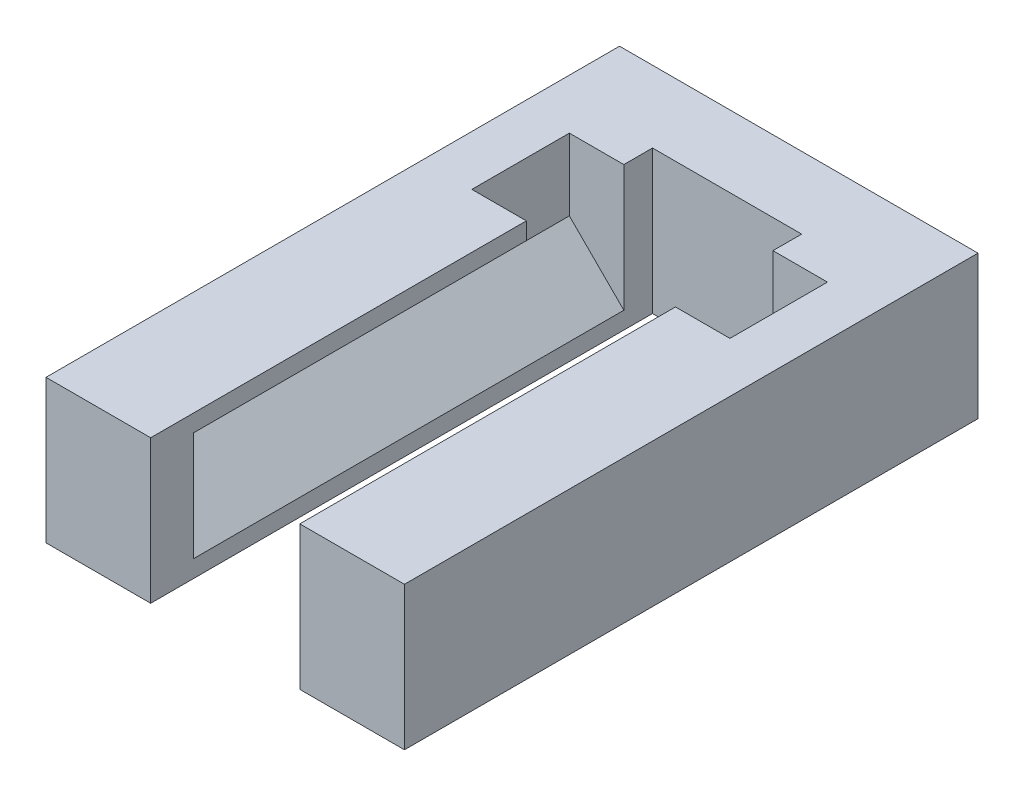
ISO-10303-21;
HEADER;
FILE_DESCRIPTION(('STEP AP214'),'2;1');
FILE_NAME('part.step','',(''),(''),'','','');
FILE_SCHEMA(('AUTOMOTIVE_DESIGN { 1 0 10303 214 1 1 1 1 }'));
ENDSEC;
DATA;
#1=APPLICATION_CONTEXT('core data for automotive mechanical design processes');
#2=APPLICATION_PROTOCOL_DEFINITION('international standard','automotive_design',2000,#1);
#3=PRODUCT_CONTEXT('',#1,'mechanical');
#4=PRODUCT('Part','Part','',(#3));
#5=PRODUCT_RELATED_PRODUCT_CATEGORY('part','',(#4));
#6=PRODUCT_DEFINITION_FORMATION('','',#4);
#7=PRODUCT_DEFINITION_CONTEXT('part definition',#1,'design');
#8=PRODUCT_DEFINITION('design','',#6,#7);
#9=PRODUCT_DEFINITION_SHAPE('','',#8);
#10=(LENGTH_UNIT() NAMED_UNIT(*) SI_UNIT(.MILLI.,.METRE.));
#11=(NAMED_UNIT(*) PLANE_ANGLE_UNIT() SI_UNIT($,.RADIAN.));
#12=(NAMED_UNIT(*) SI_UNIT($,.STERADIAN.) SOLID_ANGLE_UNIT());
#13=UNCERTAINTY_MEASURE_WITH_UNIT(LENGTH_MEASURE(1.E-05),#10,'distance_accuracy_value','');
#14=(GEOMETRIC_REPRESENTATION_CONTEXT(3) GLOBAL_UNCERTAINTY_ASSIGNED_CONTEXT((#13)) GLOBAL_UNIT_ASSIGNED_CONTEXT((#10,
#11,#12)) REPRESENTATION_CONTEXT('',''));
#15=CARTESIAN_POINT('',(0.,0.,0.));
#16=DIRECTION('',(0.,0.,1.));
#17=DIRECTION('',(1.,0.,0.));
#18=AXIS2_PLACEMENT_3D('',#15,#16,#17);
#19=CARTESIAN_POINT('',(-5.2,-5.,5.));
#20=DIRECTION('',(-1.,0.,0.));
#21=DIRECTION('',(0.,0.,1.));
#22=AXIS2_PLACEMENT_3D('',#19,#20,#21);
#23=PLANE('',#22);
#24=DIRECTION('',(0.,0.,-1.));
#25=VECTOR('',#24,1.);
#26=CARTESIAN_POINT('',(-5.2,3.79999999999999,37.));
#27=LINE('',#26,#25);
#28=CARTESIAN_POINT('',(-5.2,3.79999999999999,37.));
#29=VERTEX_POINT('',#28);
#30=CARTESIAN_POINT('',(-5.2,3.79999999999999,13.8));
#31=VERTEX_POINT('',#30);
#32=EDGE_CURVE('E226',#29,#31,#27,.T.);
#33=ORIENTED_EDGE('',*,*,#32,.T.);
#34=DIRECTION('',(0.,1.,0.));
#35=VECTOR('',#34,1.);
#36=CARTESIAN_POINT('',(-5.2,-5.,13.8));
#37=LINE('',#36,#35);
#38=CARTESIAN_POINT('',(-5.2,5.,13.8));
#39=VERTEX_POINT('',#38);
#40=EDGE_CURVE('E283',#31,#39,#37,.T.);
#41=ORIENTED_EDGE('',*,*,#40,.T.);
#42=DIRECTION('',(0.,0.,1.));
#43=VECTOR('',#42,1.);
#44=CARTESIAN_POINT('',(-5.2,5.,5.));
#45=LINE('',#44,#43);
#46=CARTESIAN_POINT('',(-5.2,5.,40.));
#47=VERTEX_POINT('',#46);
#48=EDGE_CURVE('E298',#39,#47,#45,.T.);
#49=ORIENTED_EDGE('',*,*,#48,.T.);
#50=DIRECTION('',(0.,1.,0.));
#51=VECTOR('',#50,1.);
#52=CARTESIAN_POINT('',(-5.2,-5.,40.));
#53=LINE('',#52,#51);
#54=CARTESIAN_POINT('',(-5.2,-5.,40.));
#55=VERTEX_POINT('',#54);
#56=EDGE_CURVE('E309',#55,#47,#53,.T.);
#57=ORIENTED_EDGE('',*,*,#56,.F.);
#58=DIRECTION('',(0.,0.,1.));
#59=VECTOR('',#58,1.);
#60=CARTESIAN_POINT('',(-5.2,-5.,5.));
#61=LINE('',#60,#59);
#62=CARTESIAN_POINT('',(-5.2,-5.,5.));
#63=VERTEX_POINT('',#62);
#64=EDGE_CURVE('E299',#63,#55,#61,.T.);
#65=ORIENTED_EDGE('',*,*,#64,.F.);
#66=DIRECTION('',(0.,1.,0.));
#67=VECTOR('',#66,1.);
#68=CARTESIAN_POINT('',(-5.2,-5.,5.));
#69=LINE('',#68,#67);
#70=CARTESIAN_POINT('',(-5.2,5.,5.));
#71=VERTEX_POINT('',#70);
#72=EDGE_CURVE('E322',#63,#71,#69,.T.);
#73=ORIENTED_EDGE('',*,*,#72,.T.);
#74=CARTESIAN_POINT('',(-5.2,5.,7.));
#75=VERTEX_POINT('',#74);
#76=EDGE_CURVE('E310',#71,#75,#45,.T.);
#77=ORIENTED_EDGE('',*,*,#76,.T.);
#78=DIRECTION('',(0.,-1.,0.));
#79=VECTOR('',#78,1.);
#80=CARTESIAN_POINT('',(-5.2,-5.,7.));
#81=LINE('',#80,#79);
#82=CARTESIAN_POINT('',(-5.2,-3.79999999999999,7.));
#83=VERTEX_POINT('',#82);
#84=EDGE_CURVE('E295',#75,#83,#81,.T.);
#85=ORIENTED_EDGE('',*,*,#84,.T.);
#86=DIRECTION('',(0.,0.,-1.));
#87=VECTOR('',#86,1.);
#88=CARTESIAN_POINT('',(-5.2,-3.79999999999999,37.));
#89=LINE('',#88,#87);
#90=CARTESIAN_POINT('',(-5.2,-3.79999999999999,37.));
#91=VERTEX_POINT('',#90);
#92=EDGE_CURVE('E222',#91,#83,#89,.T.);
#93=ORIENTED_EDGE('',*,*,#92,.F.);
#94=DIRECTION('',(0.,1.,0.));
#95=VECTOR('',#94,1.);
#96=CARTESIAN_POINT('',(-5.2,-3.79999999999999,37.));
#97=LINE('',#96,#95);
#98=EDGE_CURVE('E241',#91,#29,#97,.T.);
#99=ORIENTED_EDGE('',*,*,#98,.T.);
#100=EDGE_LOOP('',(#33,#41,#49,#57,#65,#73,#77,#85,#93,#99));
#101=FACE_BOUND('',#100,.T.);
#102=ADVANCED_FACE('F43',(#101),#23,.F.);
#103=CARTESIAN_POINT('',(5.2,-5.,5.));
#104=DIRECTION('',(1.,0.,0.));
#105=DIRECTION('',(0.,0.,-1.));
#106=AXIS2_PLACEMENT_3D('',#103,#104,#105);
#107=PLANE('',#106);
#108=DIRECTION('',(0.,0.,-1.));
#109=VECTOR('',#108,1.);
#110=CARTESIAN_POINT('',(5.2,3.79999999999999,37.));
#111=LINE('',#110,#109);
#112=CARTESIAN_POINT('',(5.2,3.79999999999999,37.));
#113=VERTEX_POINT('',#112);
#114=CARTESIAN_POINT('',(5.2,3.79999999999999,13.8));
#115=VERTEX_POINT('',#114);
#116=EDGE_CURVE('E209',#113,#115,#111,.T.);
#117=ORIENTED_EDGE('',*,*,#116,.F.);
#118=DIRECTION('',(0.,-1.,0.));
#119=VECTOR('',#118,1.);
#120=CARTESIAN_POINT('',(5.2,-3.79999999999999,37.));
#121=LINE('',#120,#119);
#122=CARTESIAN_POINT('',(5.2,-3.79999999999999,37.));
#123=VERTEX_POINT('',#122);
#124=EDGE_CURVE('E190',#113,#123,#121,.T.);
#125=ORIENTED_EDGE('',*,*,#124,.T.);
#126=DIRECTION('',(0.,0.,-1.));
#127=VECTOR('',#126,1.);
#128=CARTESIAN_POINT('',(5.2,-3.79999999999999,37.));
#129=LINE('',#128,#127);
#130=CARTESIAN_POINT('',(5.2,-3.79999999999999,7.));
#131=VERTEX_POINT('',#130);
#132=EDGE_CURVE('E199',#123,#131,#129,.T.);
#133=ORIENTED_EDGE('',*,*,#132,.T.);
#134=DIRECTION('',(0.,1.,0.));
#135=VECTOR('',#134,1.);
#136=CARTESIAN_POINT('',(5.2,-5.,7.));
#137=LINE('',#136,#135);
#138=CARTESIAN_POINT('',(5.2,5.,7.));
#139=VERTEX_POINT('',#138);
#140=EDGE_CURVE('E11',#131,#139,#137,.T.);
#141=ORIENTED_EDGE('',*,*,#140,.T.);
#142=DIRECTION('',(0.,0.,-1.));
#143=VECTOR('',#142,1.);
#144=CARTESIAN_POINT('',(5.2,5.,5.));
#145=LINE('',#144,#143);
#146=CARTESIAN_POINT('',(5.2,5.,5.));
#147=VERTEX_POINT('',#146);
#148=EDGE_CURVE('E314',#139,#147,#145,.T.);
#149=ORIENTED_EDGE('',*,*,#148,.T.);
#150=DIRECTION('',(0.,1.,0.));
#151=VECTOR('',#150,1.);
#152=CARTESIAN_POINT('',(5.2,-5.,5.));
#153=LINE('',#152,#151);
#154=CARTESIAN_POINT('',(5.2,-5.,5.));
#155=VERTEX_POINT('',#154);
#156=EDGE_CURVE('E326',#155,#147,#153,.T.);
#157=ORIENTED_EDGE('',*,*,#156,.F.);
#158=DIRECTION('',(0.,0.,-1.));
#159=VECTOR('',#158,1.);
#160=CARTESIAN_POINT('',(5.2,-5.,5.));
#161=LINE('',#160,#159);
#162=CARTESIAN_POINT('',(5.2,-5.,40.));
#163=VERTEX_POINT('',#162);
#164=EDGE_CURVE('E59',#163,#155,#161,.T.);
#165=ORIENTED_EDGE('',*,*,#164,.F.);
#166=DIRECTION('',(0.,1.,0.));
#167=VECTOR('',#166,1.);
#168=CARTESIAN_POINT('',(5.2,-5.,40.));
#169=LINE('',#168,#167);
#170=CARTESIAN_POINT('',(5.2,5.,40.));
#171=VERTEX_POINT('',#170);
#172=EDGE_CURVE('E330',#163,#171,#169,.T.);
#173=ORIENTED_EDGE('',*,*,#172,.T.);
#174=CARTESIAN_POINT('',(5.2,5.,13.8));
#175=VERTEX_POINT('',#174);
#176=EDGE_CURVE('E315',#171,#175,#145,.T.);
#177=ORIENTED_EDGE('',*,*,#176,.T.);
#178=DIRECTION('',(0.,-1.,0.));
#179=VECTOR('',#178,1.);
#180=CARTESIAN_POINT('',(5.2,-5.,13.8));
#181=LINE('',#180,#179);
#182=EDGE_CURVE('E52',#175,#115,#181,.T.);
#183=ORIENTED_EDGE('',*,*,#182,.T.);
#184=EDGE_LOOP('',(#117,#125,#133,#141,#149,#157,#165,#173,#177,#183));
#185=FACE_BOUND('',#184,.T.);
#186=ADVANCED_FACE('F207',(#185),#107,.F.);
#187=CARTESIAN_POINT('',(-9.,0.,13.8));
#188=DIRECTION('',(0.,0.,1.));
#189=DIRECTION('',(1.,0.,0.));
#190=AXIS2_PLACEMENT_3D('',#187,#188,#189);
#191=PLANE('',#190);
#192=DIRECTION('',(0.707106781186549,-0.707106781186546,0.));
#193=VECTOR('',#192,1.);
#194=CARTESIAN_POINT('',(0.,9.00000000000001,13.8));
#195=LINE('',#194,#193);
#196=CARTESIAN_POINT('',(9.00000000000001,0.,13.8));
#197=VERTEX_POINT('',#196);
#198=EDGE_CURVE('E250',#115,#197,#195,.T.);
#199=ORIENTED_EDGE('',*,*,#198,.F.);
#200=ORIENTED_EDGE('',*,*,#182,.F.);
#201=DIRECTION('',(1.,0.,0.));
#202=VECTOR('',#201,1.);
#203=CARTESIAN_POINT('',(-9.,5.,13.8));
#204=LINE('',#203,#202);
#205=CARTESIAN_POINT('',(9.00000000000001,5.,13.8));
#206=VERTEX_POINT('',#205);
#207=EDGE_CURVE('E266',#175,#206,#204,.T.);
#208=ORIENTED_EDGE('',*,*,#207,.T.);
#209=DIRECTION('',(0.,1.,0.));
#210=VECTOR('',#209,1.);
#211=CARTESIAN_POINT('',(9.00000000000001,0.,13.8));
#212=LINE('',#211,#210);
#213=EDGE_CURVE('E287',#197,#206,#212,.T.);
#214=ORIENTED_EDGE('',*,*,#213,.F.);
#215=EDGE_LOOP('',(#199,#200,#208,#214));
#216=FACE_BOUND('',#215,.T.);
#217=ADVANCED_FACE('F376',(#216),#191,.F.);
#218=DIRECTION('',(0.707106781186549,0.707106781186546,0.));
#219=VECTOR('',#218,1.);
#220=CARTESIAN_POINT('',(-9.,0.,13.8));
#221=LINE('',#220,#219);
#222=CARTESIAN_POINT('',(-9.00000000000001,0.,13.8));
#223=VERTEX_POINT('',#222);
#224=EDGE_CURVE('E204',#223,#31,#221,.T.);
#225=ORIENTED_EDGE('',*,*,#224,.F.);
#226=DIRECTION('',(0.,1.,0.));
#227=VECTOR('',#226,1.);
#228=CARTESIAN_POINT('',(-9.,0.,13.8));
#229=LINE('',#228,#227);
#230=CARTESIAN_POINT('',(-9.,5.,13.8));
#231=VERTEX_POINT('',#230);
#232=EDGE_CURVE('E262',#223,#231,#229,.T.);
#233=ORIENTED_EDGE('',*,*,#232,.T.);
#234=EDGE_CURVE('E267',#231,#39,#204,.T.);
#235=ORIENTED_EDGE('',*,*,#234,.T.);
#236=ORIENTED_EDGE('',*,*,#40,.F.);
#237=EDGE_LOOP('',(#225,#233,#235,#236));
#238=FACE_BOUND('',#237,.T.);
#239=ADVANCED_FACE('F413',(#238),#191,.F.);
#240=CARTESIAN_POINT('',(0.,0.,40.));
#241=DIRECTION('',(0.,0.,1.));
#242=DIRECTION('',(1.,0.,0.));
#243=AXIS2_PLACEMENT_3D('',#240,#241,#242);
#244=PLANE('',#243);
#245=ORIENTED_EDGE('',*,*,#56,.T.);
#246=DIRECTION('',(-1.,0.,0.));
#247=VECTOR('',#246,1.);
#248=CARTESIAN_POINT('',(-12.5,5.,40.));
#249=LINE('',#248,#247);
#250=CARTESIAN_POINT('',(-12.5,5.,40.));
#251=VERTEX_POINT('',#250);
#252=EDGE_CURVE('E68',#47,#251,#249,.T.);
#253=ORIENTED_EDGE('',*,*,#252,.T.);
#254=DIRECTION('',(0.,-1.,0.));
#255=VECTOR('',#254,1.);
#256=CARTESIAN_POINT('',(-12.5,5.,40.));
#257=LINE('',#256,#255);
#258=CARTESIAN_POINT('',(-12.5,-5.,40.));
#259=VERTEX_POINT('',#258);
#260=EDGE_CURVE('E335',#251,#259,#257,.T.);
#261=ORIENTED_EDGE('',*,*,#260,.T.);
#262=DIRECTION('',(1.,0.,0.));
#263=VECTOR('',#262,1.);
#264=CARTESIAN_POINT('',(-12.5,-5.,40.));
#265=LINE('',#264,#263);
#266=EDGE_CURVE('E98',#259,#55,#265,.T.);
#267=ORIENTED_EDGE('',*,*,#266,.T.);
#268=EDGE_LOOP('',(#245,#253,#261,#267));
#269=FACE_BOUND('',#268,.T.);
#270=ADVANCED_FACE('F411',(#269),#244,.T.);
#271=CARTESIAN_POINT('',(-12.5,5.,40.));
#272=DIRECTION('',(1.,0.,0.));
#273=DIRECTION('',(0.,0.,-1.));
#274=AXIS2_PLACEMENT_3D('',#271,#272,#273);
#275=PLANE('',#274);
#276=DIRECTION('',(0.,-1.,0.));
#277=VECTOR('',#276,1.);
#278=CARTESIAN_POINT('',(-12.5,5.,0.));
#279=LINE('',#278,#277);
#280=CARTESIAN_POINT('',(-12.5,5.,0.));
#281=VERTEX_POINT('',#280);
#282=CARTESIAN_POINT('',(-12.5,-5.,0.));
#283=VERTEX_POINT('',#282);
#284=EDGE_CURVE('E325',#281,#283,#279,.T.);
#285=ORIENTED_EDGE('',*,*,#284,.T.);
#286=DIRECTION('',(0.,0.,-1.));
#287=VECTOR('',#286,1.);
#288=CARTESIAN_POINT('',(-12.5,-5.,40.));
#289=LINE('',#288,#287);
#290=EDGE_CURVE('E369',#259,#283,#289,.T.);
#291=ORIENTED_EDGE('',*,*,#290,.F.);
#292=ORIENTED_EDGE('',*,*,#260,.F.);
#293=DIRECTION('',(0.,0.,-1.));
#294=VECTOR('',#293,1.);
#295=CARTESIAN_POINT('',(-12.5,5.,40.));
#296=LINE('',#295,#294);
#297=EDGE_CURVE('E348',#251,#281,#296,.T.);
#298=ORIENTED_EDGE('',*,*,#297,.T.);
#299=EDGE_LOOP('',(#285,#291,#292,#298));
#300=FACE_BOUND('',#299,.T.);
#301=ADVANCED_FACE('F45',(#300),#275,.F.);
#302=CARTESIAN_POINT('',(-12.5,-5.,40.));
#303=DIRECTION('',(0.,1.,0.));
#304=DIRECTION('',(0.,0.,1.));
#305=AXIS2_PLACEMENT_3D('',#302,#303,#304);
#306=PLANE('',#305);
#307=DIRECTION('',(-1.,0.,0.));
#308=VECTOR('',#307,1.);
#309=CARTESIAN_POINT('',(-5.2,-5.,5.));
#310=LINE('',#309,#308);
#311=EDGE_CURVE('E305',#155,#63,#310,.T.);
#312=ORIENTED_EDGE('',*,*,#311,.T.);
#313=ORIENTED_EDGE('',*,*,#64,.T.);
#314=ORIENTED_EDGE('',*,*,#266,.F.);
#315=ORIENTED_EDGE('',*,*,#290,.T.);
#316=DIRECTION('',(1.,0.,0.));
#317=VECTOR('',#316,1.);
#318=CARTESIAN_POINT('',(-12.5,-5.,0.));
#319=LINE('',#318,#317);
#320=CARTESIAN_POINT('',(12.5,-5.,0.));
#321=VERTEX_POINT('',#320);
#322=EDGE_CURVE('E352',#283,#321,#319,.T.);
#323=ORIENTED_EDGE('',*,*,#322,.T.);
#324=DIRECTION('',(0.,0.,-1.));
#325=VECTOR('',#324,1.);
#326=CARTESIAN_POINT('',(12.5,-5.,40.));
#327=LINE('',#326,#325);
#328=CARTESIAN_POINT('',(12.5,-5.,40.));
#329=VERTEX_POINT('',#328);
#330=EDGE_CURVE('E365',#329,#321,#327,.T.);
#331=ORIENTED_EDGE('',*,*,#330,.F.);
#332=EDGE_CURVE('E338',#163,#329,#265,.T.);
#333=ORIENTED_EDGE('',*,*,#332,.F.);
#334=ORIENTED_EDGE('',*,*,#164,.T.);
#335=EDGE_LOOP('',(#312,#313,#314,#315,#323,#331,#333,#334));
#336=FACE_BOUND('',#335,.T.);
#337=ADVANCED_FACE('F395',(#336),#306,.F.);
#338=CARTESIAN_POINT('',(12.5,5.,40.));
#339=DIRECTION('',(-1.,0.,0.));
#340=DIRECTION('',(0.,0.,1.));
#341=AXIS2_PLACEMENT_3D('',#338,#339,#340);
#342=PLANE('',#341);
#343=DIRECTION('',(0.,1.,0.));
#344=VECTOR('',#343,1.);
#345=CARTESIAN_POINT('',(12.5,5.,0.));
#346=LINE('',#345,#344);
#347=CARTESIAN_POINT('',(12.5,5.,0.));
#348=VERTEX_POINT('',#347);
#349=EDGE_CURVE('E355',#321,#348,#346,.T.);
#350=ORIENTED_EDGE('',*,*,#349,.T.);
#351=DIRECTION('',(0.,0.,-1.));
#352=VECTOR('',#351,1.);
#353=CARTESIAN_POINT('',(12.5,5.,40.));
#354=LINE('',#353,#352);
#355=CARTESIAN_POINT('',(12.5,5.,40.));
#356=VERTEX_POINT('',#355);
#357=EDGE_CURVE('E362',#356,#348,#354,.T.);
#358=ORIENTED_EDGE('',*,*,#357,.F.);
#359=DIRECTION('',(0.,1.,0.));
#360=VECTOR('',#359,1.);
#361=CARTESIAN_POINT('',(12.5,5.,40.));
#362=LINE('',#361,#360);
#363=EDGE_CURVE('E341',#329,#356,#362,.T.);
#364=ORIENTED_EDGE('',*,*,#363,.F.);
#365=ORIENTED_EDGE('',*,*,#330,.T.);
#366=EDGE_LOOP('',(#350,#358,#364,#365));
#367=FACE_BOUND('',#366,.T.);
#368=ADVANCED_FACE('F398',(#367),#342,.F.);
#369=CARTESIAN_POINT('',(-12.5,5.,40.));
#370=DIRECTION('',(0.,-1.,0.));
#371=DIRECTION('',(0.,0.,-1.));
#372=AXIS2_PLACEMENT_3D('',#369,#370,#371);
#373=PLANE('',#372);
#374=ORIENTED_EDGE('',*,*,#148,.F.);
#375=DIRECTION('',(-1.,0.,0.));
#376=VECTOR('',#375,1.);
#377=CARTESIAN_POINT('',(-9.,5.,7.));
#378=LINE('',#377,#376);
#379=CARTESIAN_POINT('',(9.00000000000001,5.,7.));
#380=VERTEX_POINT('',#379);
#381=EDGE_CURVE('E259',#380,#139,#378,.T.);
#382=ORIENTED_EDGE('',*,*,#381,.F.);
#383=DIRECTION('',(0.,0.,-1.));
#384=VECTOR('',#383,1.);
#385=CARTESIAN_POINT('',(9.00000000000001,5.,7.));
#386=LINE('',#385,#384);
#387=EDGE_CURVE('E271',#206,#380,#386,.T.);
#388=ORIENTED_EDGE('',*,*,#387,.F.);
#389=ORIENTED_EDGE('',*,*,#207,.F.);
#390=ORIENTED_EDGE('',*,*,#176,.F.);
#391=EDGE_CURVE('E344',#356,#171,#249,.T.);
#392=ORIENTED_EDGE('',*,*,#391,.F.);
#393=ORIENTED_EDGE('',*,*,#357,.T.);
#394=DIRECTION('',(-1.,0.,0.));
#395=VECTOR('',#394,1.);
#396=CARTESIAN_POINT('',(-12.5,5.,0.));
#397=LINE('',#396,#395);
#398=EDGE_CURVE('E90',#348,#281,#397,.T.);
#399=ORIENTED_EDGE('',*,*,#398,.T.);
#400=ORIENTED_EDGE('',*,*,#297,.F.);
#401=ORIENTED_EDGE('',*,*,#252,.F.);
#402=ORIENTED_EDGE('',*,*,#48,.F.);
#403=ORIENTED_EDGE('',*,*,#234,.F.);
#404=DIRECTION('',(0.,0.,1.));
#405=VECTOR('',#404,1.);
#406=CARTESIAN_POINT('',(-9.,5.,7.));
#407=LINE('',#406,#405);
#408=CARTESIAN_POINT('',(-9.,5.,7.));
#409=VERTEX_POINT('',#408);
#410=EDGE_CURVE('E254',#409,#231,#407,.T.);
#411=ORIENTED_EDGE('',*,*,#410,.F.);
#412=EDGE_CURVE('E275',#75,#409,#378,.T.);
#413=ORIENTED_EDGE('',*,*,#412,.F.);
#414=ORIENTED_EDGE('',*,*,#76,.F.);
#415=DIRECTION('',(-1.,0.,0.));
#416=VECTOR('',#415,1.);
#417=CARTESIAN_POINT('',(-5.2,5.,5.));
#418=LINE('',#417,#416);
#419=EDGE_CURVE('E302',#147,#71,#418,.T.);
#420=ORIENTED_EDGE('',*,*,#419,.F.);
#421=EDGE_LOOP('',(#374,#382,#388,#389,#390,#392,#393,#399,#400,#401,#402,#403,#411,#413,#414,#420));
#422=FACE_BOUND('',#421,.T.);
#423=ADVANCED_FACE('F380',(#422),#373,.F.);
#424=ORIENTED_EDGE('',*,*,#172,.F.);
#425=ORIENTED_EDGE('',*,*,#332,.T.);
#426=ORIENTED_EDGE('',*,*,#363,.T.);
#427=ORIENTED_EDGE('',*,*,#391,.T.);
#428=EDGE_LOOP('',(#424,#425,#426,#427));
#429=FACE_BOUND('',#428,.T.);
#430=ADVANCED_FACE('F392',(#429),#244,.T.);
#431=CARTESIAN_POINT('',(0.,0.,0.));
#432=DIRECTION('',(0.,0.,1.));
#433=DIRECTION('',(1.,0.,0.));
#434=AXIS2_PLACEMENT_3D('',#431,#432,#433);
#435=PLANE('',#434);
#436=ORIENTED_EDGE('',*,*,#284,.F.);
#437=ORIENTED_EDGE('',*,*,#398,.F.);
#438=ORIENTED_EDGE('',*,*,#349,.F.);
#439=ORIENTED_EDGE('',*,*,#322,.F.);
#440=EDGE_LOOP('',(#436,#437,#438,#439));
#441=FACE_BOUND('',#440,.T.);
#442=ADVANCED_FACE('F401',(#441),#435,.F.);
#443=CARTESIAN_POINT('',(-5.2,-5.,5.));
#444=DIRECTION('',(0.,0.,-1.));
#445=DIRECTION('',(-1.,0.,0.));
#446=AXIS2_PLACEMENT_3D('',#443,#444,#445);
#447=PLANE('',#446);
#448=ORIENTED_EDGE('',*,*,#419,.T.);
#449=ORIENTED_EDGE('',*,*,#72,.F.);
#450=ORIENTED_EDGE('',*,*,#311,.F.);
#451=ORIENTED_EDGE('',*,*,#156,.T.);
#452=EDGE_LOOP('',(#448,#449,#450,#451));
#453=FACE_BOUND('',#452,.T.);
#454=ADVANCED_FACE('F430',(#453),#447,.F.);
#455=CARTESIAN_POINT('',(-9.,0.,7.));
#456=DIRECTION('',(0.,0.,-1.));
#457=DIRECTION('',(-1.,0.,0.));
#458=AXIS2_PLACEMENT_3D('',#455,#456,#457);
#459=PLANE('',#458);
#460=ORIENTED_EDGE('',*,*,#140,.F.);
#461=DIRECTION('',(0.707106781186549,0.707106781186546,0.));
#462=VECTOR('',#461,1.);
#463=CARTESIAN_POINT('',(9.00000000000001,0.,7.));
#464=LINE('',#463,#462);
#465=CARTESIAN_POINT('',(9.00000000000001,0.,7.));
#466=VERTEX_POINT('',#465);
#467=EDGE_CURVE('E202',#131,#466,#464,.T.);
#468=ORIENTED_EDGE('',*,*,#467,.T.);
#469=DIRECTION('',(0.,1.,0.));
#470=VECTOR('',#469,1.);
#471=CARTESIAN_POINT('',(9.00000000000001,0.,7.));
#472=LINE('',#471,#470);
#473=EDGE_CURVE('E284',#466,#380,#472,.T.);
#474=ORIENTED_EDGE('',*,*,#473,.T.);
#475=ORIENTED_EDGE('',*,*,#381,.T.);
#476=EDGE_LOOP('',(#460,#468,#474,#475));
#477=FACE_BOUND('',#476,.T.);
#478=ADVANCED_FACE('F433',(#477),#459,.F.);
#479=CARTESIAN_POINT('',(9.00000000000001,0.,7.));
#480=DIRECTION('',(1.,0.,0.));
#481=DIRECTION('',(0.,0.,-1.));
#482=AXIS2_PLACEMENT_3D('',#479,#480,#481);
#483=PLANE('',#482);
#484=ORIENTED_EDGE('',*,*,#387,.T.);
#485=ORIENTED_EDGE('',*,*,#473,.F.);
#486=DIRECTION('',(0.,0.,-1.));
#487=VECTOR('',#486,1.);
#488=CARTESIAN_POINT('',(9.00000000000001,0.,7.));
#489=LINE('',#488,#487);
#490=EDGE_CURVE('E258',#197,#466,#489,.T.);
#491=ORIENTED_EDGE('',*,*,#490,.F.);
#492=ORIENTED_EDGE('',*,*,#213,.T.);
#493=EDGE_LOOP('',(#484,#485,#491,#492));
#494=FACE_BOUND('',#493,.T.);
#495=ADVANCED_FACE('F442',(#494),#483,.F.);
#496=DIRECTION('',(0.707106781186549,-0.707106781186546,0.));
#497=VECTOR('',#496,1.);
#498=CARTESIAN_POINT('',(-9.00000000000001,0.,7.));
#499=LINE('',#498,#497);
#500=CARTESIAN_POINT('',(-9.,0.,7.));
#501=VERTEX_POINT('',#500);
#502=EDGE_CURVE('E213',#501,#83,#499,.T.);
#503=ORIENTED_EDGE('',*,*,#502,.T.);
#504=ORIENTED_EDGE('',*,*,#84,.F.);
#505=ORIENTED_EDGE('',*,*,#412,.T.);
#506=DIRECTION('',(0.,1.,0.));
#507=VECTOR('',#506,1.);
#508=CARTESIAN_POINT('',(-9.,0.,7.));
#509=LINE('',#508,#507);
#510=EDGE_CURVE('E279',#501,#409,#509,.T.);
#511=ORIENTED_EDGE('',*,*,#510,.F.);
#512=EDGE_LOOP('',(#503,#504,#505,#511));
#513=FACE_BOUND('',#512,.T.);
#514=ADVANCED_FACE('F438',(#513),#459,.F.);
#515=CARTESIAN_POINT('',(-9.,0.,7.));
#516=DIRECTION('',(-1.,0.,0.));
#517=DIRECTION('',(0.,0.,1.));
#518=AXIS2_PLACEMENT_3D('',#515,#516,#517);
#519=PLANE('',#518);
#520=ORIENTED_EDGE('',*,*,#410,.T.);
#521=ORIENTED_EDGE('',*,*,#232,.F.);
#522=DIRECTION('',(0.,0.,1.));
#523=VECTOR('',#522,1.);
#524=CARTESIAN_POINT('',(-9.,0.,7.));
#525=LINE('',#524,#523);
#526=EDGE_CURVE('E255',#501,#223,#525,.T.);
#527=ORIENTED_EDGE('',*,*,#526,.F.);
#528=ORIENTED_EDGE('',*,*,#510,.T.);
#529=EDGE_LOOP('',(#520,#521,#527,#528));
#530=FACE_BOUND('',#529,.T.);
#531=ADVANCED_FACE('F435',(#530),#519,.F.);
#532=CARTESIAN_POINT('',(-5.2,3.79999999999999,37.));
#533=DIRECTION('',(0.707106781186546,-0.707106781186549,0.));
#534=DIRECTION('',(0.707106781186549,0.707106781186546,0.));
#535=AXIS2_PLACEMENT_3D('',#532,#533,#534);
#536=PLANE('',#535);
#537=ORIENTED_EDGE('',*,*,#224,.T.);
#538=ORIENTED_EDGE('',*,*,#32,.F.);
#539=DIRECTION('',(-0.707106781186549,-0.707106781186546,0.));
#540=VECTOR('',#539,1.);
#541=CARTESIAN_POINT('',(-5.2,3.79999999999999,37.));
#542=LINE('',#541,#540);
#543=CARTESIAN_POINT('',(-9.00000000000001,0.,37.));
#544=VERTEX_POINT('',#543);
#545=EDGE_CURVE('E234',#29,#544,#542,.T.);
#546=ORIENTED_EDGE('',*,*,#545,.T.);
#547=DIRECTION('',(0.,0.,-1.));
#548=VECTOR('',#547,1.);
#549=CARTESIAN_POINT('',(-9.00000000000001,0.,37.));
#550=LINE('',#549,#548);
#551=EDGE_CURVE('E230',#544,#223,#550,.T.);
#552=ORIENTED_EDGE('',*,*,#551,.T.);
#553=EDGE_LOOP('',(#537,#538,#546,#552));
#554=FACE_BOUND('',#553,.T.);
#555=ADVANCED_FACE('F437',(#554),#536,.T.);
#556=CARTESIAN_POINT('',(-9.00000000000001,0.,37.));
#557=DIRECTION('',(0.707106781186546,0.707106781186549,0.));
#558=DIRECTION('',(-0.707106781186549,0.707106781186546,0.));
#559=AXIS2_PLACEMENT_3D('',#556,#557,#558);
#560=PLANE('',#559);
#561=ORIENTED_EDGE('',*,*,#502,.F.);
#562=ORIENTED_EDGE('',*,*,#526,.T.);
#563=ORIENTED_EDGE('',*,*,#551,.F.);
#564=DIRECTION('',(0.707106781186549,-0.707106781186546,0.));
#565=VECTOR('',#564,1.);
#566=CARTESIAN_POINT('',(-9.00000000000001,0.,37.));
#567=LINE('',#566,#565);
#568=EDGE_CURVE('E238',#544,#91,#567,.T.);
#569=ORIENTED_EDGE('',*,*,#568,.T.);
#570=ORIENTED_EDGE('',*,*,#92,.T.);
#571=EDGE_LOOP('',(#561,#562,#563,#569,#570));
#572=FACE_BOUND('',#571,.T.);
#573=ADVANCED_FACE('F453',(#572),#560,.T.);
#574=CARTESIAN_POINT('',(0.,0.,37.));
#575=DIRECTION('',(0.,0.,-1.));
#576=DIRECTION('',(-1.,0.,0.));
#577=AXIS2_PLACEMENT_3D('',#574,#575,#576);
#578=PLANE('',#577);
#579=ORIENTED_EDGE('',*,*,#568,.F.);
#580=ORIENTED_EDGE('',*,*,#545,.F.);
#581=ORIENTED_EDGE('',*,*,#98,.F.);
#582=EDGE_LOOP('',(#579,#580,#581));
#583=FACE_BOUND('',#582,.T.);
#584=ADVANCED_FACE('F449',(#583),#578,.T.);
#585=CARTESIAN_POINT('',(5.2,3.79999999999999,37.));
#586=DIRECTION('',(-0.707106781186546,-0.707106781186549,0.));
#587=DIRECTION('',(0.707106781186549,-0.707106781186546,0.));
#588=AXIS2_PLACEMENT_3D('',#585,#586,#587);
#589=PLANE('',#588);
#590=ORIENTED_EDGE('',*,*,#198,.T.);
#591=DIRECTION('',(0.,0.,-1.));
#592=VECTOR('',#591,1.);
#593=CARTESIAN_POINT('',(9.00000000000001,0.,37.));
#594=LINE('',#593,#592);
#595=CARTESIAN_POINT('',(9.00000000000001,0.,37.));
#596=VERTEX_POINT('',#595);
#597=EDGE_CURVE('E205',#596,#197,#594,.T.);
#598=ORIENTED_EDGE('',*,*,#597,.F.);
#599=DIRECTION('',(-0.707106781186549,0.707106781186546,0.));
#600=VECTOR('',#599,1.);
#601=CARTESIAN_POINT('',(5.2,3.79999999999999,37.));
#602=LINE('',#601,#600);
#603=EDGE_CURVE('E192',#596,#113,#602,.T.);
#604=ORIENTED_EDGE('',*,*,#603,.T.);
#605=ORIENTED_EDGE('',*,*,#116,.T.);
#606=EDGE_LOOP('',(#590,#598,#604,#605));
#607=FACE_BOUND('',#606,.T.);
#608=ADVANCED_FACE('F452',(#607),#589,.T.);
#609=CARTESIAN_POINT('',(9.00000000000001,0.,37.));
#610=DIRECTION('',(-0.707106781186546,0.707106781186549,0.));
#611=DIRECTION('',(-0.707106781186549,-0.707106781186546,0.));
#612=AXIS2_PLACEMENT_3D('',#609,#610,#611);
#613=PLANE('',#612);
#614=ORIENTED_EDGE('',*,*,#467,.F.);
#615=ORIENTED_EDGE('',*,*,#132,.F.);
#616=DIRECTION('',(0.707106781186549,0.707106781186546,0.));
#617=VECTOR('',#616,1.);
#618=CARTESIAN_POINT('',(9.00000000000001,0.,37.));
#619=LINE('',#618,#617);
#620=EDGE_CURVE('E186',#123,#596,#619,.T.);
#621=ORIENTED_EDGE('',*,*,#620,.T.);
#622=ORIENTED_EDGE('',*,*,#597,.T.);
#623=ORIENTED_EDGE('',*,*,#490,.T.);
#624=EDGE_LOOP('',(#614,#615,#621,#622,#623));
#625=FACE_BOUND('',#624,.T.);
#626=ADVANCED_FACE('F200',(#625),#613,.T.);
#627=CARTESIAN_POINT('',(0.,0.,37.));
#628=DIRECTION('',(0.,0.,-1.));
#629=DIRECTION('',(-1.,0.,0.));
#630=AXIS2_PLACEMENT_3D('',#627,#628,#629);
#631=PLANE('',#630);
#632=ORIENTED_EDGE('',*,*,#124,.F.);
#633=ORIENTED_EDGE('',*,*,#603,.F.);
#634=ORIENTED_EDGE('',*,*,#620,.F.);
#635=EDGE_LOOP('',(#632,#633,#634));
#636=FACE_BOUND('',#635,.T.);
#637=ADVANCED_FACE('F188',(#636),#631,.T.);
#638=CLOSED_SHELL('',(#102,#186,#217,#239,#270,#301,#337,#368,#423,#430,#442,#454,#478,#495,
#514,#531,#555,#573,#584,#608,#626,#637));
#639=MANIFOLD_SOLID_BREP('B2',#638);
#640=ADVANCED_BREP_SHAPE_REPRESENTATION('',(#18,#639),#14);
#641=SHAPE_DEFINITION_REPRESENTATION(#9,#640);
ENDSEC;
END-ISO-10303-21;
